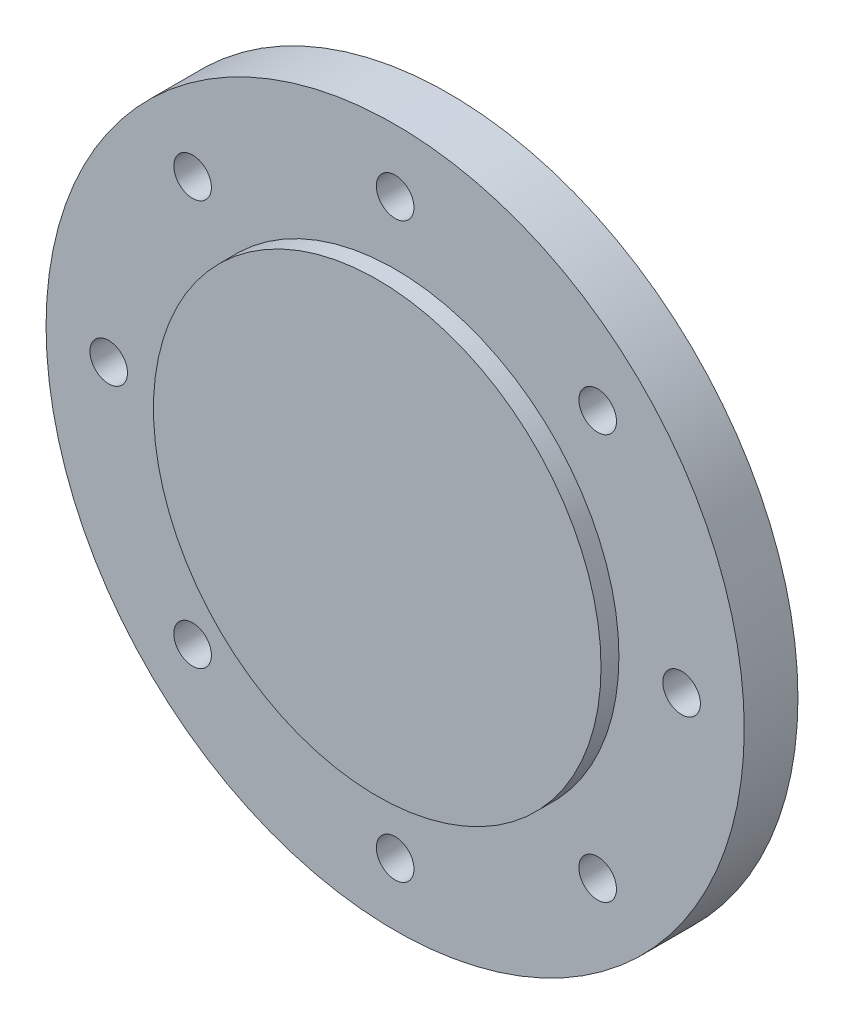
ISO-10303-21;
HEADER;
FILE_DESCRIPTION(('STEP AP214'),'2;1');
FILE_NAME('part.step','',(''),(''),'','','');
FILE_SCHEMA(('AUTOMOTIVE_DESIGN { 1 0 10303 214 1 1 1 1 }'));
ENDSEC;
DATA;
#1=APPLICATION_CONTEXT('core data for automotive mechanical design processes');
#2=APPLICATION_PROTOCOL_DEFINITION('international standard','automotive_design',2000,#1);
#3=PRODUCT_CONTEXT('',#1,'mechanical');
#4=PRODUCT('Part','Part','',(#3));
#5=PRODUCT_RELATED_PRODUCT_CATEGORY('part','',(#4));
#6=PRODUCT_DEFINITION_FORMATION('','',#4);
#7=PRODUCT_DEFINITION_CONTEXT('part definition',#1,'design');
#8=PRODUCT_DEFINITION('design','',#6,#7);
#9=PRODUCT_DEFINITION_SHAPE('','',#8);
#10=(LENGTH_UNIT() NAMED_UNIT(*) SI_UNIT(.MILLI.,.METRE.));
#11=(NAMED_UNIT(*) PLANE_ANGLE_UNIT() SI_UNIT($,.RADIAN.));
#12=(NAMED_UNIT(*) SI_UNIT($,.STERADIAN.) SOLID_ANGLE_UNIT());
#13=UNCERTAINTY_MEASURE_WITH_UNIT(LENGTH_MEASURE(1.E-05),#10,'distance_accuracy_value','');
#14=(GEOMETRIC_REPRESENTATION_CONTEXT(3) GLOBAL_UNCERTAINTY_ASSIGNED_CONTEXT((#13)) GLOBAL_UNIT_ASSIGNED_CONTEXT((#10,
#11,#12)) REPRESENTATION_CONTEXT('',''));
#15=CARTESIAN_POINT('',(0.,0.,0.));
#16=DIRECTION('',(0.,0.,1.));
#17=DIRECTION('',(1.,0.,0.));
#18=AXIS2_PLACEMENT_3D('',#15,#16,#17);
#19=CARTESIAN_POINT('',(0.,0.,6.));
#20=DIRECTION('',(0.,0.,-1.));
#21=DIRECTION('',(-1.,0.,0.));
#22=AXIS2_PLACEMENT_3D('',#19,#20,#21);
#23=CYLINDRICAL_SURFACE('',#22,39.);
#24=CARTESIAN_POINT('',(0.,0.,6.));
#25=DIRECTION('',(0.,0.,1.));
#26=DIRECTION('',(1.,0.,0.));
#27=AXIS2_PLACEMENT_3D('',#24,#25,#26);
#28=CIRCLE('',#27,39.);
#29=CARTESIAN_POINT('',(39.,0.,6.));
#30=VERTEX_POINT('',#29);
#31=EDGE_CURVE('E42',#30,#30,#28,.T.);
#32=ORIENTED_EDGE('',*,*,#31,.F.);
#33=EDGE_LOOP('',(#32));
#34=FACE_BOUND('',#33,.T.);
#35=CARTESIAN_POINT('',(0.,0.,0.));
#36=DIRECTION('',(0.,0.,1.));
#37=DIRECTION('',(1.,0.,0.));
#38=AXIS2_PLACEMENT_3D('',#35,#36,#37);
#39=CIRCLE('',#38,39.);
#40=CARTESIAN_POINT('',(39.,0.,0.));
#41=VERTEX_POINT('',#40);
#42=EDGE_CURVE('E37',#41,#41,#39,.T.);
#43=ORIENTED_EDGE('',*,*,#42,.T.);
#44=EDGE_LOOP('',(#43));
#45=FACE_BOUND('',#44,.T.);
#46=ADVANCED_FACE('F40',(#34,#45),#23,.T.);
#47=CARTESIAN_POINT('',(0.,0.,6.));
#48=DIRECTION('',(0.,0.,1.));
#49=DIRECTION('',(1.,0.,0.));
#50=AXIS2_PLACEMENT_3D('',#47,#48,#49);
#51=PLANE('',#50);
#52=CARTESIAN_POINT('',(0.,32.,6.));
#53=DIRECTION('',(0.,0.,1.));
#54=DIRECTION('',(0.,1.,0.));
#55=AXIS2_PLACEMENT_3D('',#52,#53,#54);
#56=CIRCLE('',#55,2.1);
#57=CARTESIAN_POINT('',(0.,34.1,6.));
#58=VERTEX_POINT('',#57);
#59=EDGE_CURVE('E85',#58,#58,#56,.T.);
#60=ORIENTED_EDGE('',*,*,#59,.F.);
#61=EDGE_LOOP('',(#60));
#62=FACE_BOUND('',#61,.T.);
#63=CARTESIAN_POINT('',(-22.6274169979695,22.6274169979695,6.));
#64=DIRECTION('',(0.,0.,1.));
#65=DIRECTION('',(-0.707106781186547,0.707106781186548,0.));
#66=AXIS2_PLACEMENT_3D('',#63,#64,#65);
#67=CIRCLE('',#66,2.1);
#68=CARTESIAN_POINT('',(-24.1123412384613,24.1123412384613,6.));
#69=VERTEX_POINT('',#68);
#70=EDGE_CURVE('E78',#69,#69,#67,.T.);
#71=ORIENTED_EDGE('',*,*,#70,.F.);
#72=EDGE_LOOP('',(#71));
#73=FACE_BOUND('',#72,.T.);
#74=CARTESIAN_POINT('',(-32.,0.,6.));
#75=DIRECTION('',(0.,0.,1.));
#76=DIRECTION('',(-1.,0.,0.));
#77=AXIS2_PLACEMENT_3D('',#74,#75,#76);
#78=CIRCLE('',#77,2.1);
#79=CARTESIAN_POINT('',(-34.1,0.,6.));
#80=VERTEX_POINT('',#79);
#81=EDGE_CURVE('E71',#80,#80,#78,.T.);
#82=ORIENTED_EDGE('',*,*,#81,.F.);
#83=EDGE_LOOP('',(#82));
#84=FACE_BOUND('',#83,.T.);
#85=CARTESIAN_POINT('',(-22.6274169979695,-22.6274169979695,6.));
#86=DIRECTION('',(0.,0.,1.));
#87=DIRECTION('',(-0.707106781186548,-0.707106781186547,0.));
#88=AXIS2_PLACEMENT_3D('',#85,#86,#87);
#89=CIRCLE('',#88,2.1);
#90=CARTESIAN_POINT('',(-24.1123412384613,-24.1123412384613,6.));
#91=VERTEX_POINT('',#90);
#92=EDGE_CURVE('E66',#91,#91,#89,.T.);
#93=ORIENTED_EDGE('',*,*,#92,.F.);
#94=EDGE_LOOP('',(#93));
#95=FACE_BOUND('',#94,.T.);
#96=CARTESIAN_POINT('',(0.,-32.,6.));
#97=DIRECTION('',(0.,0.,1.));
#98=DIRECTION('',(0.,-1.,0.));
#99=AXIS2_PLACEMENT_3D('',#96,#97,#98);
#100=CIRCLE('',#99,2.1);
#101=CARTESIAN_POINT('',(0.,-34.1,6.));
#102=VERTEX_POINT('',#101);
#103=EDGE_CURVE('E96',#102,#102,#100,.T.);
#104=ORIENTED_EDGE('',*,*,#103,.F.);
#105=EDGE_LOOP('',(#104));
#106=FACE_BOUND('',#105,.T.);
#107=CARTESIAN_POINT('',(22.6274169979695,-22.6274169979695,6.));
#108=DIRECTION('',(0.,0.,1.));
#109=DIRECTION('',(0.707106781186547,-0.707106781186548,0.));
#110=AXIS2_PLACEMENT_3D('',#107,#108,#109);
#111=CIRCLE('',#110,2.1);
#112=CARTESIAN_POINT('',(24.1123412384613,-24.1123412384613,6.));
#113=VERTEX_POINT('',#112);
#114=EDGE_CURVE('E89',#113,#113,#111,.T.);
#115=ORIENTED_EDGE('',*,*,#114,.F.);
#116=EDGE_LOOP('',(#115));
#117=FACE_BOUND('',#116,.T.);
#118=CARTESIAN_POINT('',(22.6274169979695,22.6274169979695,6.));
#119=DIRECTION('',(0.,0.,1.));
#120=DIRECTION('',(0.707106781186548,0.707106781186548,0.));
#121=AXIS2_PLACEMENT_3D('',#118,#119,#120);
#122=CIRCLE('',#121,2.1);
#123=CARTESIAN_POINT('',(24.1123412384613,24.1123412384613,6.));
#124=VERTEX_POINT('',#123);
#125=EDGE_CURVE('E58',#124,#124,#122,.T.);
#126=ORIENTED_EDGE('',*,*,#125,.F.);
#127=EDGE_LOOP('',(#126));
#128=FACE_BOUND('',#127,.T.);
#129=CARTESIAN_POINT('',(32.,0.,6.));
#130=DIRECTION('',(0.,0.,1.));
#131=DIRECTION('',(1.,0.,0.));
#132=AXIS2_PLACEMENT_3D('',#129,#130,#131);
#133=CIRCLE('',#132,2.1);
#134=CARTESIAN_POINT('',(34.1,0.,6.));
#135=VERTEX_POINT('',#134);
#136=EDGE_CURVE('E53',#135,#135,#133,.T.);
#137=ORIENTED_EDGE('',*,*,#136,.F.);
#138=EDGE_LOOP('',(#137));
#139=FACE_BOUND('',#138,.T.);
#140=CARTESIAN_POINT('',(0.,0.,6.));
#141=DIRECTION('',(0.,0.,1.));
#142=DIRECTION('',(1.,0.,0.));
#143=AXIS2_PLACEMENT_3D('',#140,#141,#142);
#144=CIRCLE('',#143,25.);
#145=CARTESIAN_POINT('',(25.,0.,6.));
#146=VERTEX_POINT('',#145);
#147=EDGE_CURVE('E10',#146,#146,#144,.T.);
#148=ORIENTED_EDGE('',*,*,#147,.F.);
#149=EDGE_LOOP('',(#148));
#150=FACE_BOUND('',#149,.T.);
#151=ORIENTED_EDGE('',*,*,#31,.T.);
#152=EDGE_LOOP('',(#151));
#153=FACE_BOUND('',#152,.T.);
#154=ADVANCED_FACE('F114',(#62,#73,#84,#95,#106,#117,#128,#139,#150,#153),#51,.T.);
#155=CARTESIAN_POINT('',(0.,0.,0.));
#156=DIRECTION('',(0.,0.,1.));
#157=DIRECTION('',(1.,0.,0.));
#158=AXIS2_PLACEMENT_3D('',#155,#156,#157);
#159=PLANE('',#158);
#160=CARTESIAN_POINT('',(0.,32.,0.));
#161=DIRECTION('',(0.,0.,1.));
#162=DIRECTION('',(0.,1.,0.));
#163=AXIS2_PLACEMENT_3D('',#160,#161,#162);
#164=CIRCLE('',#163,2.1);
#165=CARTESIAN_POINT('',(0.,34.1,0.));
#166=VERTEX_POINT('',#165);
#167=EDGE_CURVE('E65',#166,#166,#164,.T.);
#168=ORIENTED_EDGE('',*,*,#167,.T.);
#169=EDGE_LOOP('',(#168));
#170=FACE_BOUND('',#169,.T.);
#171=CARTESIAN_POINT('',(-22.6274169979695,22.6274169979695,0.));
#172=DIRECTION('',(0.,0.,1.));
#173=DIRECTION('',(-0.707106781186547,0.707106781186548,0.));
#174=AXIS2_PLACEMENT_3D('',#171,#172,#173);
#175=CIRCLE('',#174,2.1);
#176=CARTESIAN_POINT('',(-24.1123412384613,24.1123412384613,0.));
#177=VERTEX_POINT('',#176);
#178=EDGE_CURVE('E82',#177,#177,#175,.T.);
#179=ORIENTED_EDGE('',*,*,#178,.T.);
#180=EDGE_LOOP('',(#179));
#181=FACE_BOUND('',#180,.T.);
#182=CARTESIAN_POINT('',(-32.,0.,0.));
#183=DIRECTION('',(0.,0.,1.));
#184=DIRECTION('',(-1.,0.,0.));
#185=AXIS2_PLACEMENT_3D('',#182,#183,#184);
#186=CIRCLE('',#185,2.1);
#187=CARTESIAN_POINT('',(-34.1,0.,0.));
#188=VERTEX_POINT('',#187);
#189=EDGE_CURVE('E79',#188,#188,#186,.T.);
#190=ORIENTED_EDGE('',*,*,#189,.T.);
#191=EDGE_LOOP('',(#190));
#192=FACE_BOUND('',#191,.T.);
#193=CARTESIAN_POINT('',(-22.6274169979695,-22.6274169979695,0.));
#194=DIRECTION('',(0.,0.,1.));
#195=DIRECTION('',(-0.707106781186548,-0.707106781186547,0.));
#196=AXIS2_PLACEMENT_3D('',#193,#194,#195);
#197=CIRCLE('',#196,2.1);
#198=CARTESIAN_POINT('',(-24.1123412384613,-24.1123412384613,0.));
#199=VERTEX_POINT('',#198);
#200=EDGE_CURVE('E68',#199,#199,#197,.T.);
#201=ORIENTED_EDGE('',*,*,#200,.T.);
#202=EDGE_LOOP('',(#201));
#203=FACE_BOUND('',#202,.T.);
#204=CARTESIAN_POINT('',(0.,-32.,0.));
#205=DIRECTION('',(0.,0.,1.));
#206=DIRECTION('',(0.,-1.,0.));
#207=AXIS2_PLACEMENT_3D('',#204,#205,#206);
#208=CIRCLE('',#207,2.1);
#209=CARTESIAN_POINT('',(0.,-34.1,0.));
#210=VERTEX_POINT('',#209);
#211=EDGE_CURVE('E70',#210,#210,#208,.T.);
#212=ORIENTED_EDGE('',*,*,#211,.T.);
#213=EDGE_LOOP('',(#212));
#214=FACE_BOUND('',#213,.T.);
#215=CARTESIAN_POINT('',(22.6274169979695,-22.6274169979695,0.));
#216=DIRECTION('',(0.,0.,1.));
#217=DIRECTION('',(0.707106781186547,-0.707106781186548,0.));
#218=AXIS2_PLACEMENT_3D('',#215,#216,#217);
#219=CIRCLE('',#218,2.1);
#220=CARTESIAN_POINT('',(24.1123412384613,-24.1123412384613,0.));
#221=VERTEX_POINT('',#220);
#222=EDGE_CURVE('E91',#221,#221,#219,.T.);
#223=ORIENTED_EDGE('',*,*,#222,.T.);
#224=EDGE_LOOP('',(#223));
#225=FACE_BOUND('',#224,.T.);
#226=CARTESIAN_POINT('',(22.6274169979695,22.6274169979695,0.));
#227=DIRECTION('',(0.,0.,1.));
#228=DIRECTION('',(0.707106781186548,0.707106781186548,0.));
#229=AXIS2_PLACEMENT_3D('',#226,#227,#228);
#230=CIRCLE('',#229,2.1);
#231=CARTESIAN_POINT('',(24.1123412384613,24.1123412384613,0.));
#232=VERTEX_POINT('',#231);
#233=EDGE_CURVE('E60',#232,#232,#230,.T.);
#234=ORIENTED_EDGE('',*,*,#233,.T.);
#235=EDGE_LOOP('',(#234));
#236=FACE_BOUND('',#235,.T.);
#237=CARTESIAN_POINT('',(32.,0.,0.));
#238=DIRECTION('',(0.,0.,1.));
#239=DIRECTION('',(1.,0.,0.));
#240=AXIS2_PLACEMENT_3D('',#237,#238,#239);
#241=CIRCLE('',#240,2.1);
#242=CARTESIAN_POINT('',(34.1,0.,0.));
#243=VERTEX_POINT('',#242);
#244=EDGE_CURVE('E52',#243,#243,#241,.T.);
#245=ORIENTED_EDGE('',*,*,#244,.T.);
#246=EDGE_LOOP('',(#245));
#247=FACE_BOUND('',#246,.T.);
#248=ORIENTED_EDGE('',*,*,#42,.F.);
#249=EDGE_LOOP('',(#248));
#250=FACE_BOUND('',#249,.T.);
#251=ADVANCED_FACE('F105',(#170,#181,#192,#203,#214,#225,#236,#247,#250),#159,.F.);
#252=CARTESIAN_POINT('',(0.,0.,8.));
#253=DIRECTION('',(0.,0.,-1.));
#254=DIRECTION('',(-1.,0.,0.));
#255=AXIS2_PLACEMENT_3D('',#252,#253,#254);
#256=CYLINDRICAL_SURFACE('',#255,25.);
#257=CARTESIAN_POINT('',(0.,0.,8.));
#258=DIRECTION('',(0.,0.,1.));
#259=DIRECTION('',(1.,0.,0.));
#260=AXIS2_PLACEMENT_3D('',#257,#258,#259);
#261=CIRCLE('',#260,25.);
#262=CARTESIAN_POINT('',(25.,0.,8.));
#263=VERTEX_POINT('',#262);
#264=EDGE_CURVE('E49',#263,#263,#261,.T.);
#265=ORIENTED_EDGE('',*,*,#264,.F.);
#266=EDGE_LOOP('',(#265));
#267=FACE_BOUND('',#266,.T.);
#268=ORIENTED_EDGE('',*,*,#147,.T.);
#269=EDGE_LOOP('',(#268));
#270=FACE_BOUND('',#269,.T.);
#271=ADVANCED_FACE('F135',(#267,#270),#256,.T.);
#272=CARTESIAN_POINT('',(0.,0.,8.));
#273=DIRECTION('',(0.,0.,1.));
#274=DIRECTION('',(1.,0.,0.));
#275=AXIS2_PLACEMENT_3D('',#272,#273,#274);
#276=PLANE('',#275);
#277=ORIENTED_EDGE('',*,*,#264,.T.);
#278=EDGE_LOOP('',(#277));
#279=FACE_BOUND('',#278,.T.);
#280=ADVANCED_FACE('F138',(#279),#276,.T.);
#281=CARTESIAN_POINT('',(32.,0.,0.));
#282=DIRECTION('',(0.,0.,1.));
#283=DIRECTION('',(1.,0.,0.));
#284=AXIS2_PLACEMENT_3D('',#281,#282,#283);
#285=CYLINDRICAL_SURFACE('',#284,2.1);
#286=ORIENTED_EDGE('',*,*,#244,.F.);
#287=EDGE_LOOP('',(#286));
#288=FACE_BOUND('',#287,.T.);
#289=ORIENTED_EDGE('',*,*,#136,.T.);
#290=EDGE_LOOP('',(#289));
#291=FACE_BOUND('',#290,.T.);
#292=ADVANCED_FACE('F148',(#288,#291),#285,.F.);
#293=CARTESIAN_POINT('',(22.6274169979695,22.6274169979695,0.));
#294=DIRECTION('',(0.,0.,1.));
#295=DIRECTION('',(1.,0.,0.));
#296=AXIS2_PLACEMENT_3D('',#293,#294,#295);
#297=CYLINDRICAL_SURFACE('',#296,2.1);
#298=ORIENTED_EDGE('',*,*,#233,.F.);
#299=EDGE_LOOP('',(#298));
#300=FACE_BOUND('',#299,.T.);
#301=ORIENTED_EDGE('',*,*,#125,.T.);
#302=EDGE_LOOP('',(#301));
#303=FACE_BOUND('',#302,.T.);
#304=ADVANCED_FACE('F147',(#300,#303),#297,.F.);
#305=CARTESIAN_POINT('',(22.6274169979695,-22.6274169979695,0.));
#306=DIRECTION('',(0.,0.,1.));
#307=DIRECTION('',(1.,0.,0.));
#308=AXIS2_PLACEMENT_3D('',#305,#306,#307);
#309=CYLINDRICAL_SURFACE('',#308,2.1);
#310=ORIENTED_EDGE('',*,*,#222,.F.);
#311=EDGE_LOOP('',(#310));
#312=FACE_BOUND('',#311,.T.);
#313=ORIENTED_EDGE('',*,*,#114,.T.);
#314=EDGE_LOOP('',(#313));
#315=FACE_BOUND('',#314,.T.);
#316=ADVANCED_FACE('F108',(#312,#315),#309,.F.);
#317=CARTESIAN_POINT('',(0.,-32.,0.));
#318=DIRECTION('',(0.,0.,1.));
#319=DIRECTION('',(1.,0.,0.));
#320=AXIS2_PLACEMENT_3D('',#317,#318,#319);
#321=CYLINDRICAL_SURFACE('',#320,2.1);
#322=ORIENTED_EDGE('',*,*,#211,.F.);
#323=EDGE_LOOP('',(#322));
#324=FACE_BOUND('',#323,.T.);
#325=ORIENTED_EDGE('',*,*,#103,.T.);
#326=EDGE_LOOP('',(#325));
#327=FACE_BOUND('',#326,.T.);
#328=ADVANCED_FACE('F104',(#324,#327),#321,.F.);
#329=CARTESIAN_POINT('',(-22.6274169979695,-22.6274169979695,0.));
#330=DIRECTION('',(0.,0.,1.));
#331=DIRECTION('',(1.,0.,0.));
#332=AXIS2_PLACEMENT_3D('',#329,#330,#331);
#333=CYLINDRICAL_SURFACE('',#332,2.1);
#334=ORIENTED_EDGE('',*,*,#200,.F.);
#335=EDGE_LOOP('',(#334));
#336=FACE_BOUND('',#335,.T.);
#337=ORIENTED_EDGE('',*,*,#92,.T.);
#338=EDGE_LOOP('',(#337));
#339=FACE_BOUND('',#338,.T.);
#340=ADVANCED_FACE('F107',(#336,#339),#333,.F.);
#341=CARTESIAN_POINT('',(-32.,0.,0.));
#342=DIRECTION('',(0.,0.,1.));
#343=DIRECTION('',(1.,0.,0.));
#344=AXIS2_PLACEMENT_3D('',#341,#342,#343);
#345=CYLINDRICAL_SURFACE('',#344,2.1);
#346=ORIENTED_EDGE('',*,*,#189,.F.);
#347=EDGE_LOOP('',(#346));
#348=FACE_BOUND('',#347,.T.);
#349=ORIENTED_EDGE('',*,*,#81,.T.);
#350=EDGE_LOOP('',(#349));
#351=FACE_BOUND('',#350,.T.);
#352=ADVANCED_FACE('F156',(#348,#351),#345,.F.);
#353=CARTESIAN_POINT('',(-22.6274169979695,22.6274169979695,0.));
#354=DIRECTION('',(0.,0.,1.));
#355=DIRECTION('',(1.,0.,0.));
#356=AXIS2_PLACEMENT_3D('',#353,#354,#355);
#357=CYLINDRICAL_SURFACE('',#356,2.1);
#358=ORIENTED_EDGE('',*,*,#178,.F.);
#359=EDGE_LOOP('',(#358));
#360=FACE_BOUND('',#359,.T.);
#361=ORIENTED_EDGE('',*,*,#70,.T.);
#362=EDGE_LOOP('',(#361));
#363=FACE_BOUND('',#362,.T.);
#364=ADVANCED_FACE('F159',(#360,#363),#357,.F.);
#365=CARTESIAN_POINT('',(0.,32.,0.));
#366=DIRECTION('',(0.,0.,1.));
#367=DIRECTION('',(1.,0.,0.));
#368=AXIS2_PLACEMENT_3D('',#365,#366,#367);
#369=CYLINDRICAL_SURFACE('',#368,2.1);
#370=ORIENTED_EDGE('',*,*,#167,.F.);
#371=EDGE_LOOP('',(#370));
#372=FACE_BOUND('',#371,.T.);
#373=ORIENTED_EDGE('',*,*,#59,.T.);
#374=EDGE_LOOP('',(#373));
#375=FACE_BOUND('',#374,.T.);
#376=ADVANCED_FACE('F163',(#372,#375),#369,.F.);
#377=CLOSED_SHELL('',(#46,#154,#251,#271,#280,#292,#304,#316,#328,#340,#352,#364,#376));
#378=MANIFOLD_SOLID_BREP('B2',#377);
#379=ADVANCED_BREP_SHAPE_REPRESENTATION('',(#18,#378),#14);
#380=SHAPE_DEFINITION_REPRESENTATION(#9,#379);
ENDSEC;
END-ISO-10303-21;
